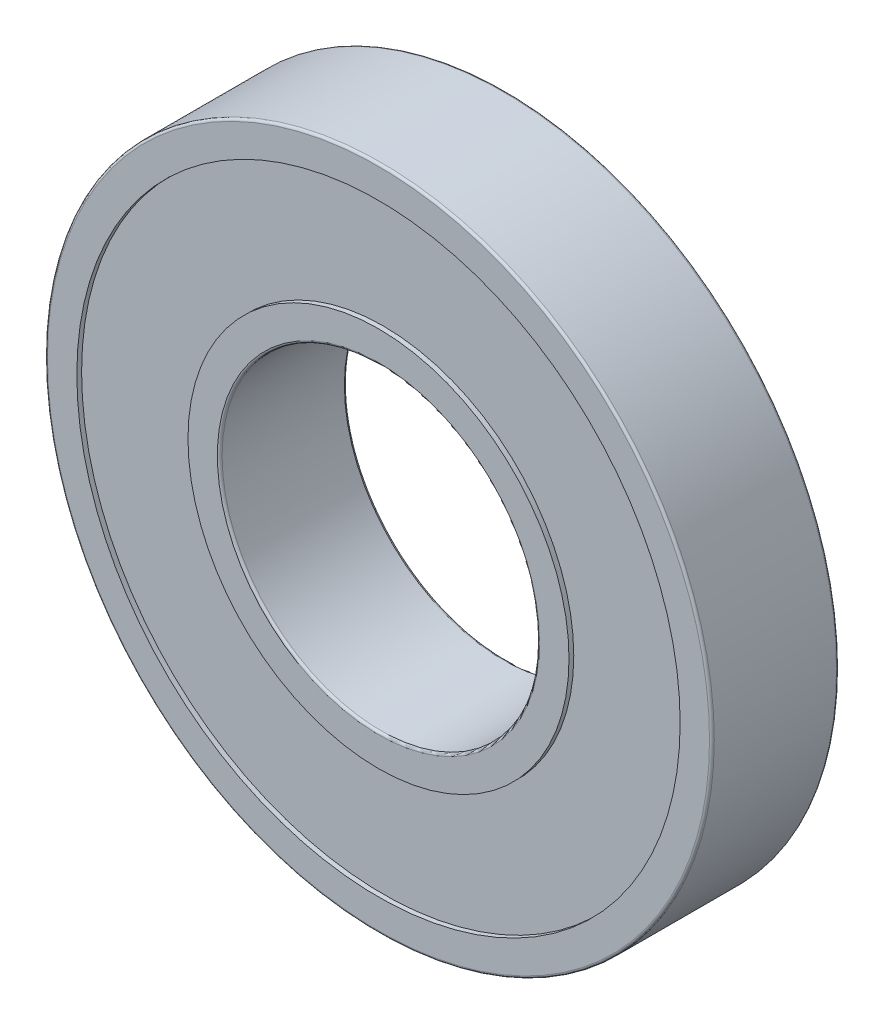
ISO-10303-21;
HEADER;
FILE_DESCRIPTION(('STEP AP214'),'2;1');
FILE_NAME('part.step','',(''),(''),'','','');
FILE_SCHEMA(('AUTOMOTIVE_DESIGN { 1 0 10303 214 1 1 1 1 }'));
ENDSEC;
DATA;
#1=APPLICATION_CONTEXT('core data for automotive mechanical design processes');
#2=APPLICATION_PROTOCOL_DEFINITION('international standard','automotive_design',2000,#1);
#3=PRODUCT_CONTEXT('',#1,'mechanical');
#4=PRODUCT('Part','Part','',(#3));
#5=PRODUCT_RELATED_PRODUCT_CATEGORY('part','',(#4));
#6=PRODUCT_DEFINITION_FORMATION('','',#4);
#7=PRODUCT_DEFINITION_CONTEXT('part definition',#1,'design');
#8=PRODUCT_DEFINITION('design','',#6,#7);
#9=PRODUCT_DEFINITION_SHAPE('','',#8);
#10=(LENGTH_UNIT() NAMED_UNIT(*) SI_UNIT(.MILLI.,.METRE.));
#11=(NAMED_UNIT(*) PLANE_ANGLE_UNIT() SI_UNIT($,.RADIAN.));
#12=(NAMED_UNIT(*) SI_UNIT($,.STERADIAN.) SOLID_ANGLE_UNIT());
#13=UNCERTAINTY_MEASURE_WITH_UNIT(LENGTH_MEASURE(1.E-05),#10,'distance_accuracy_value','');
#14=(GEOMETRIC_REPRESENTATION_CONTEXT(3) GLOBAL_UNCERTAINTY_ASSIGNED_CONTEXT((#13)) GLOBAL_UNIT_ASSIGNED_CONTEXT((#10,
#11,#12)) REPRESENTATION_CONTEXT('',''));
#15=CARTESIAN_POINT('',(0.,0.,0.));
#16=DIRECTION('',(0.,0.,1.));
#17=DIRECTION('',(1.,0.,0.));
#18=AXIS2_PLACEMENT_3D('',#15,#16,#17);
#19=CARTESIAN_POINT('',(0.,0.,0.));
#20=DIRECTION('',(0.,0.,1.));
#21=DIRECTION('',(1.,0.,0.));
#22=AXIS2_PLACEMENT_3D('',#19,#20,#21);
#23=PLANE('',#22);
#24=CARTESIAN_POINT('',(0.,0.,0.));
#25=DIRECTION('',(0.,0.,1.));
#26=DIRECTION('',(1.,0.,0.));
#27=AXIS2_PLACEMENT_3D('',#24,#25,#26);
#28=CIRCLE('',#27,10.15);
#29=CARTESIAN_POINT('',(10.15,0.,0.));
#30=VERTEX_POINT('',#29);
#31=EDGE_CURVE('E62',#30,#30,#28,.T.);
#32=ORIENTED_EDGE('',*,*,#31,.T.);
#33=EDGE_LOOP('',(#32));
#34=FACE_BOUND('',#33,.T.);
#35=CARTESIAN_POINT('',(0.,0.,0.));
#36=DIRECTION('',(0.,0.,1.));
#37=DIRECTION('',(1.,0.,0.));
#38=AXIS2_PLACEMENT_3D('',#35,#36,#37);
#39=CIRCLE('',#38,12.);
#40=CARTESIAN_POINT('',(12.,0.,0.));
#41=VERTEX_POINT('',#40);
#42=EDGE_CURVE('E84',#41,#41,#39,.T.);
#43=ORIENTED_EDGE('',*,*,#42,.F.);
#44=EDGE_LOOP('',(#43));
#45=FACE_BOUND('',#44,.T.);
#46=ADVANCED_FACE('F33',(#34,#45),#23,.F.);
#47=CARTESIAN_POINT('',(0.,0.,8.));
#48=DIRECTION('',(0.,0.,1.));
#49=DIRECTION('',(1.,0.,0.));
#50=AXIS2_PLACEMENT_3D('',#47,#48,#49);
#51=PLANE('',#50);
#52=CARTESIAN_POINT('',(0.,0.,8.));
#53=DIRECTION('',(0.,0.,1.));
#54=DIRECTION('',(1.,0.,0.));
#55=AXIS2_PLACEMENT_3D('',#52,#53,#54);
#56=CIRCLE('',#55,10.15);
#57=CARTESIAN_POINT('',(10.15,0.,8.));
#58=VERTEX_POINT('',#57);
#59=EDGE_CURVE('E40',#58,#58,#56,.F.);
#60=ORIENTED_EDGE('',*,*,#59,.T.);
#61=EDGE_LOOP('',(#60));
#62=FACE_BOUND('',#61,.T.);
#63=CARTESIAN_POINT('',(0.,0.,8.));
#64=DIRECTION('',(0.,0.,1.));
#65=DIRECTION('',(1.,0.,0.));
#66=AXIS2_PLACEMENT_3D('',#63,#64,#65);
#67=CIRCLE('',#66,12.);
#68=CARTESIAN_POINT('',(12.,0.,8.));
#69=VERTEX_POINT('',#68);
#70=EDGE_CURVE('E72',#69,#69,#67,.T.);
#71=ORIENTED_EDGE('',*,*,#70,.T.);
#72=EDGE_LOOP('',(#71));
#73=FACE_BOUND('',#72,.T.);
#74=ADVANCED_FACE('F101',(#62,#73),#51,.T.);
#75=CARTESIAN_POINT('',(0.,0.,8.));
#76=DIRECTION('',(0.,0.,1.));
#77=DIRECTION('',(1.,0.,0.));
#78=AXIS2_PLACEMENT_3D('',#75,#76,#77);
#79=CIRCLE('',#78,20.85);
#80=CARTESIAN_POINT('',(20.85,0.,8.));
#81=VERTEX_POINT('',#80);
#82=EDGE_CURVE('E10',#81,#81,#79,.T.);
#83=ORIENTED_EDGE('',*,*,#82,.T.);
#84=EDGE_LOOP('',(#83));
#85=FACE_BOUND('',#84,.T.);
#86=CARTESIAN_POINT('',(0.,0.,8.));
#87=DIRECTION('',(0.,0.,1.));
#88=DIRECTION('',(1.,0.,0.));
#89=AXIS2_PLACEMENT_3D('',#86,#87,#88);
#90=CIRCLE('',#89,19.);
#91=CARTESIAN_POINT('',(19.,0.,8.));
#92=VERTEX_POINT('',#91);
#93=EDGE_CURVE('E66',#92,#92,#90,.T.);
#94=ORIENTED_EDGE('',*,*,#93,.F.);
#95=EDGE_LOOP('',(#94));
#96=FACE_BOUND('',#95,.T.);
#97=ADVANCED_FACE('F108',(#85,#96),#51,.T.);
#98=CARTESIAN_POINT('',(0.,0.,0.));
#99=DIRECTION('',(0.,0.,1.));
#100=DIRECTION('',(1.,0.,0.));
#101=AXIS2_PLACEMENT_3D('',#98,#99,#100);
#102=CIRCLE('',#101,20.85);
#103=CARTESIAN_POINT('',(20.85,0.,0.));
#104=VERTEX_POINT('',#103);
#105=EDGE_CURVE('E44',#104,#104,#102,.F.);
#106=ORIENTED_EDGE('',*,*,#105,.T.);
#107=EDGE_LOOP('',(#106));
#108=FACE_BOUND('',#107,.T.);
#109=CARTESIAN_POINT('',(0.,0.,0.));
#110=DIRECTION('',(0.,0.,1.));
#111=DIRECTION('',(1.,0.,0.));
#112=AXIS2_PLACEMENT_3D('',#109,#110,#111);
#113=CIRCLE('',#112,19.);
#114=CARTESIAN_POINT('',(19.,0.,0.));
#115=VERTEX_POINT('',#114);
#116=EDGE_CURVE('E78',#115,#115,#113,.T.);
#117=ORIENTED_EDGE('',*,*,#116,.T.);
#118=EDGE_LOOP('',(#117));
#119=FACE_BOUND('',#118,.T.);
#120=ADVANCED_FACE('F104',(#108,#119),#23,.F.);
#121=CARTESIAN_POINT('',(0.,0.,8.));
#122=DIRECTION('',(0.,0.,-1.));
#123=DIRECTION('',(-1.,0.,0.));
#124=AXIS2_PLACEMENT_3D('',#121,#122,#123);
#125=CYLINDRICAL_SURFACE('',#124,21.);
#126=CARTESIAN_POINT('',(0.,0.,0.150000000000001));
#127=DIRECTION('',(0.,0.,1.));
#128=DIRECTION('',(1.,0.,0.));
#129=AXIS2_PLACEMENT_3D('',#126,#127,#128);
#130=CIRCLE('',#129,21.);
#131=CARTESIAN_POINT('',(21.,0.,0.150000000000001));
#132=VERTEX_POINT('',#131);
#133=EDGE_CURVE('E48',#132,#132,#130,.T.);
#134=ORIENTED_EDGE('',*,*,#133,.T.);
#135=EDGE_LOOP('',(#134));
#136=FACE_BOUND('',#135,.T.);
#137=CARTESIAN_POINT('',(0.,0.,7.85));
#138=DIRECTION('',(0.,0.,1.));
#139=DIRECTION('',(1.,0.,0.));
#140=AXIS2_PLACEMENT_3D('',#137,#138,#139);
#141=CIRCLE('',#140,21.);
#142=CARTESIAN_POINT('',(21.,0.,7.85));
#143=VERTEX_POINT('',#142);
#144=EDGE_CURVE('E53',#143,#143,#141,.F.);
#145=ORIENTED_EDGE('',*,*,#144,.T.);
#146=EDGE_LOOP('',(#145));
#147=FACE_BOUND('',#146,.T.);
#148=ADVANCED_FACE('F112',(#136,#147),#125,.T.);
#149=CARTESIAN_POINT('',(0.,0.,8.));
#150=DIRECTION('',(0.,0.,-1.));
#151=DIRECTION('',(-1.,0.,0.));
#152=AXIS2_PLACEMENT_3D('',#149,#150,#151);
#153=CYLINDRICAL_SURFACE('',#152,10.);
#154=CARTESIAN_POINT('',(0.,0.,0.150000000000001));
#155=DIRECTION('',(0.,0.,1.));
#156=DIRECTION('',(1.,0.,0.));
#157=AXIS2_PLACEMENT_3D('',#154,#155,#156);
#158=CIRCLE('',#157,10.);
#159=CARTESIAN_POINT('',(10.,0.,0.150000000000001));
#160=VERTEX_POINT('',#159);
#161=EDGE_CURVE('E56',#160,#160,#158,.F.);
#162=ORIENTED_EDGE('',*,*,#161,.T.);
#163=EDGE_LOOP('',(#162));
#164=FACE_BOUND('',#163,.T.);
#165=CARTESIAN_POINT('',(0.,0.,7.85));
#166=DIRECTION('',(0.,0.,1.));
#167=DIRECTION('',(1.,0.,0.));
#168=AXIS2_PLACEMENT_3D('',#165,#166,#167);
#169=CIRCLE('',#168,10.);
#170=CARTESIAN_POINT('',(10.,0.,7.85));
#171=VERTEX_POINT('',#170);
#172=EDGE_CURVE('E59',#171,#171,#169,.T.);
#173=ORIENTED_EDGE('',*,*,#172,.T.);
#174=EDGE_LOOP('',(#173));
#175=FACE_BOUND('',#174,.T.);
#176=ADVANCED_FACE('F118',(#164,#175),#153,.F.);
#177=CARTESIAN_POINT('',(0.,0.,7.7));
#178=DIRECTION('',(0.,0.,1.));
#179=DIRECTION('',(1.,0.,0.));
#180=AXIS2_PLACEMENT_3D('',#177,#178,#179);
#181=CYLINDRICAL_SURFACE('',#180,19.);
#182=CARTESIAN_POINT('',(0.,0.,7.7));
#183=DIRECTION('',(0.,0.,1.));
#184=DIRECTION('',(1.,0.,0.));
#185=AXIS2_PLACEMENT_3D('',#182,#183,#184);
#186=CIRCLE('',#185,19.);
#187=CARTESIAN_POINT('',(19.,0.,7.7));
#188=VERTEX_POINT('',#187);
#189=EDGE_CURVE('E65',#188,#188,#186,.T.);
#190=ORIENTED_EDGE('',*,*,#189,.F.);
#191=EDGE_LOOP('',(#190));
#192=FACE_BOUND('',#191,.T.);
#193=ORIENTED_EDGE('',*,*,#93,.T.);
#194=EDGE_LOOP('',(#193));
#195=FACE_BOUND('',#194,.T.);
#196=ADVANCED_FACE('F140',(#192,#195),#181,.F.);
#197=CARTESIAN_POINT('',(0.,0.,7.7));
#198=DIRECTION('',(0.,0.,1.));
#199=DIRECTION('',(1.,0.,0.));
#200=AXIS2_PLACEMENT_3D('',#197,#198,#199);
#201=PLANE('',#200);
#202=CARTESIAN_POINT('',(0.,0.,7.7));
#203=DIRECTION('',(0.,0.,1.));
#204=DIRECTION('',(1.,0.,0.));
#205=AXIS2_PLACEMENT_3D('',#202,#203,#204);
#206=CIRCLE('',#205,12.);
#207=CARTESIAN_POINT('',(12.,0.,7.7));
#208=VERTEX_POINT('',#207);
#209=EDGE_CURVE('E69',#208,#208,#206,.T.);
#210=ORIENTED_EDGE('',*,*,#209,.F.);
#211=EDGE_LOOP('',(#210));
#212=FACE_BOUND('',#211,.T.);
#213=ORIENTED_EDGE('',*,*,#189,.T.);
#214=EDGE_LOOP('',(#213));
#215=FACE_BOUND('',#214,.T.);
#216=ADVANCED_FACE('F136',(#212,#215),#201,.T.);
#217=CARTESIAN_POINT('',(0.,0.,7.7));
#218=DIRECTION('',(0.,0.,1.));
#219=DIRECTION('',(1.,0.,0.));
#220=AXIS2_PLACEMENT_3D('',#217,#218,#219);
#221=CYLINDRICAL_SURFACE('',#220,12.);
#222=ORIENTED_EDGE('',*,*,#209,.T.);
#223=EDGE_LOOP('',(#222));
#224=FACE_BOUND('',#223,.T.);
#225=ORIENTED_EDGE('',*,*,#70,.F.);
#226=EDGE_LOOP('',(#225));
#227=FACE_BOUND('',#226,.T.);
#228=ADVANCED_FACE('F130',(#224,#227),#221,.T.);
#229=CARTESIAN_POINT('',(0.,0.,0.5));
#230=DIRECTION('',(0.,0.,1.));
#231=DIRECTION('',(1.,0.,0.));
#232=AXIS2_PLACEMENT_3D('',#229,#230,#231);
#233=PLANE('',#232);
#234=CARTESIAN_POINT('',(0.,0.,0.5));
#235=DIRECTION('',(0.,0.,1.));
#236=DIRECTION('',(1.,0.,0.));
#237=AXIS2_PLACEMENT_3D('',#234,#235,#236);
#238=CIRCLE('',#237,19.);
#239=CARTESIAN_POINT('',(19.,0.,0.5));
#240=VERTEX_POINT('',#239);
#241=EDGE_CURVE('E75',#240,#240,#238,.T.);
#242=ORIENTED_EDGE('',*,*,#241,.F.);
#243=EDGE_LOOP('',(#242));
#244=FACE_BOUND('',#243,.T.);
#245=CARTESIAN_POINT('',(0.,0.,0.5));
#246=DIRECTION('',(0.,0.,1.));
#247=DIRECTION('',(1.,0.,0.));
#248=AXIS2_PLACEMENT_3D('',#245,#246,#247);
#249=CIRCLE('',#248,12.);
#250=CARTESIAN_POINT('',(12.,0.,0.5));
#251=VERTEX_POINT('',#250);
#252=EDGE_CURVE('E81',#251,#251,#249,.T.);
#253=ORIENTED_EDGE('',*,*,#252,.T.);
#254=EDGE_LOOP('',(#253));
#255=FACE_BOUND('',#254,.T.);
#256=ADVANCED_FACE('F90',(#244,#255),#233,.F.);
#257=CARTESIAN_POINT('',(0.,0.,0.5));
#258=DIRECTION('',(0.,0.,-1.));
#259=DIRECTION('',(-1.,0.,0.));
#260=AXIS2_PLACEMENT_3D('',#257,#258,#259);
#261=CYLINDRICAL_SURFACE('',#260,19.);
#262=ORIENTED_EDGE('',*,*,#241,.T.);
#263=EDGE_LOOP('',(#262));
#264=FACE_BOUND('',#263,.T.);
#265=ORIENTED_EDGE('',*,*,#116,.F.);
#266=EDGE_LOOP('',(#265));
#267=FACE_BOUND('',#266,.T.);
#268=ADVANCED_FACE('F96',(#264,#267),#261,.F.);
#269=CARTESIAN_POINT('',(0.,0.,0.5));
#270=DIRECTION('',(0.,0.,-1.));
#271=DIRECTION('',(-1.,0.,0.));
#272=AXIS2_PLACEMENT_3D('',#269,#270,#271);
#273=CYLINDRICAL_SURFACE('',#272,12.);
#274=ORIENTED_EDGE('',*,*,#252,.F.);
#275=EDGE_LOOP('',(#274));
#276=FACE_BOUND('',#275,.T.);
#277=ORIENTED_EDGE('',*,*,#42,.T.);
#278=EDGE_LOOP('',(#277));
#279=FACE_BOUND('',#278,.T.);
#280=ADVANCED_FACE('F92',(#276,#279),#273,.T.);
#281=CARTESIAN_POINT('',(0.,0.,0.150000000000001));
#282=DIRECTION('',(0.,0.,1.));
#283=DIRECTION('',(1.,0.,0.));
#284=AXIS2_PLACEMENT_3D('',#281,#282,#283);
#285=TOROIDAL_SURFACE('',#284,10.15,0.15);
#286=ORIENTED_EDGE('',*,*,#161,.F.);
#287=EDGE_LOOP('',(#286));
#288=FACE_BOUND('',#287,.T.);
#289=ORIENTED_EDGE('',*,*,#31,.F.);
#290=EDGE_LOOP('',(#289));
#291=FACE_BOUND('',#290,.T.);
#292=ADVANCED_FACE('F95',(#288,#291),#285,.T.);
#293=CARTESIAN_POINT('',(0.,0.,0.150000000000001));
#294=DIRECTION('',(0.,0.,1.));
#295=DIRECTION('',(1.,0.,0.));
#296=AXIS2_PLACEMENT_3D('',#293,#294,#295);
#297=TOROIDAL_SURFACE('',#296,20.85,0.15);
#298=ORIENTED_EDGE('',*,*,#105,.F.);
#299=EDGE_LOOP('',(#298));
#300=FACE_BOUND('',#299,.T.);
#301=ORIENTED_EDGE('',*,*,#133,.F.);
#302=EDGE_LOOP('',(#301));
#303=FACE_BOUND('',#302,.T.);
#304=ADVANCED_FACE('F155',(#300,#303),#297,.T.);
#305=CARTESIAN_POINT('',(0.,0.,7.85));
#306=DIRECTION('',(0.,0.,1.));
#307=DIRECTION('',(1.,0.,0.));
#308=AXIS2_PLACEMENT_3D('',#305,#306,#307);
#309=TOROIDAL_SURFACE('',#308,10.15,0.15);
#310=ORIENTED_EDGE('',*,*,#59,.F.);
#311=EDGE_LOOP('',(#310));
#312=FACE_BOUND('',#311,.T.);
#313=ORIENTED_EDGE('',*,*,#172,.F.);
#314=EDGE_LOOP('',(#313));
#315=FACE_BOUND('',#314,.T.);
#316=ADVANCED_FACE('F153',(#312,#315),#309,.T.);
#317=CARTESIAN_POINT('',(0.,0.,7.85));
#318=DIRECTION('',(0.,0.,1.));
#319=DIRECTION('',(1.,0.,0.));
#320=AXIS2_PLACEMENT_3D('',#317,#318,#319);
#321=TOROIDAL_SURFACE('',#320,20.85,0.15);
#322=ORIENTED_EDGE('',*,*,#144,.F.);
#323=EDGE_LOOP('',(#322));
#324=FACE_BOUND('',#323,.T.);
#325=ORIENTED_EDGE('',*,*,#82,.F.);
#326=EDGE_LOOP('',(#325));
#327=FACE_BOUND('',#326,.T.);
#328=ADVANCED_FACE('F35',(#324,#327),#321,.T.);
#329=CLOSED_SHELL('',(#46,#74,#97,#120,#148,#176,#196,#216,#228,#256,#268,#280,#292,#304,#316,#328));
#330=MANIFOLD_SOLID_BREP('B2',#329);
#331=ADVANCED_BREP_SHAPE_REPRESENTATION('',(#18,#330),#14);
#332=SHAPE_DEFINITION_REPRESENTATION(#9,#331);
ENDSEC;
END-ISO-10303-21;
